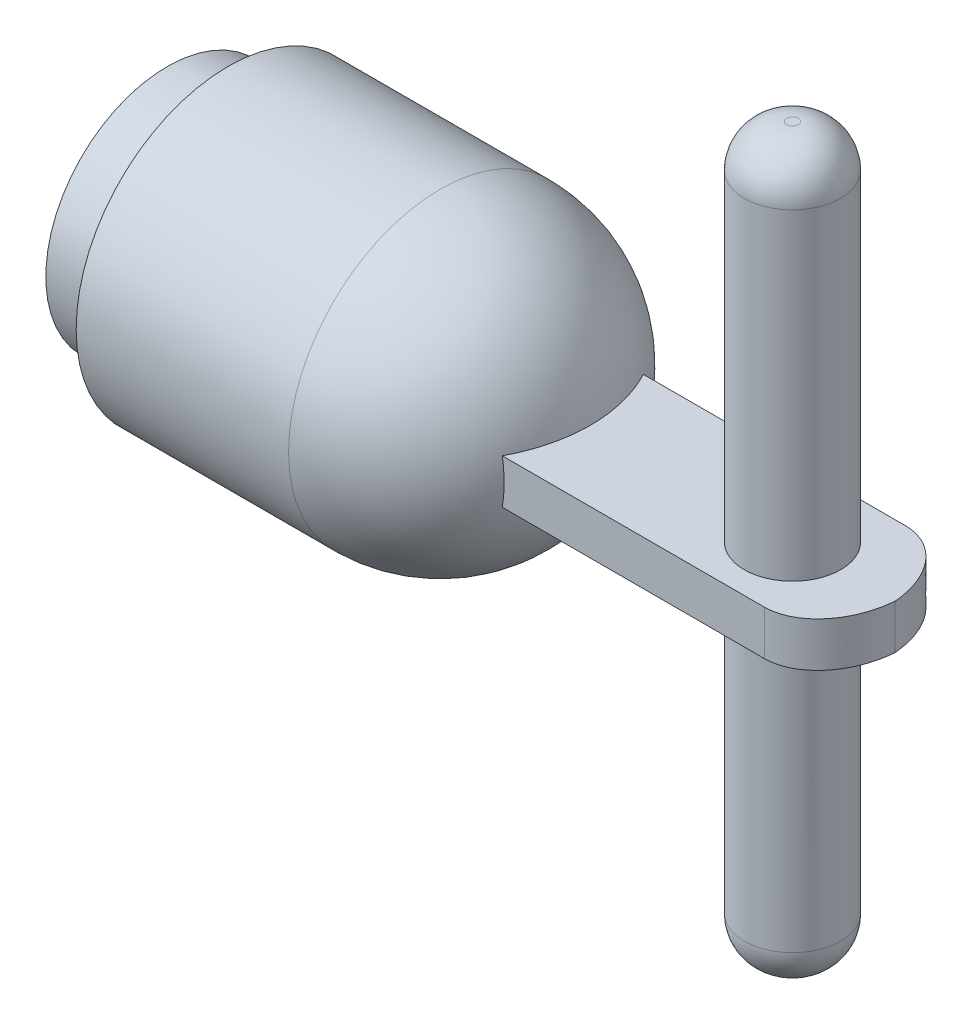
ISO-10303-21;
HEADER;
FILE_DESCRIPTION(('STEP AP214'),'2;1');
FILE_NAME('part.step','',(''),(''),'','','');
FILE_SCHEMA(('AUTOMOTIVE_DESIGN { 1 0 10303 214 1 1 1 1 }'));
ENDSEC;
DATA;
#1=APPLICATION_CONTEXT('core data for automotive mechanical design processes');
#2=APPLICATION_PROTOCOL_DEFINITION('international standard','automotive_design',2000,#1);
#3=PRODUCT_CONTEXT('',#1,'mechanical');
#4=PRODUCT('Part','Part','',(#3));
#5=PRODUCT_RELATED_PRODUCT_CATEGORY('part','',(#4));
#6=PRODUCT_DEFINITION_FORMATION('','',#4);
#7=PRODUCT_DEFINITION_CONTEXT('part definition',#1,'design');
#8=PRODUCT_DEFINITION('design','',#6,#7);
#9=PRODUCT_DEFINITION_SHAPE('','',#8);
#10=(LENGTH_UNIT() NAMED_UNIT(*) SI_UNIT(.MILLI.,.METRE.));
#11=(NAMED_UNIT(*) PLANE_ANGLE_UNIT() SI_UNIT($,.RADIAN.));
#12=(NAMED_UNIT(*) SI_UNIT($,.STERADIAN.) SOLID_ANGLE_UNIT());
#13=UNCERTAINTY_MEASURE_WITH_UNIT(LENGTH_MEASURE(1.E-05),#10,'distance_accuracy_value','');
#14=(GEOMETRIC_REPRESENTATION_CONTEXT(3) GLOBAL_UNCERTAINTY_ASSIGNED_CONTEXT((#13)) GLOBAL_UNIT_ASSIGNED_CONTEXT((#10,
#11,#12)) REPRESENTATION_CONTEXT('',''));
#15=CARTESIAN_POINT('',(0.,0.,0.));
#16=DIRECTION('',(0.,0.,1.));
#17=DIRECTION('',(1.,0.,0.));
#18=AXIS2_PLACEMENT_3D('',#15,#16,#17);
#19=CARTESIAN_POINT('',(10.,0.,0.));
#20=DIRECTION('',(-1.,0.,0.));
#21=DIRECTION('',(0.,0.,1.));
#22=AXIS2_PLACEMENT_3D('',#19,#20,#21);
#23=CYLINDRICAL_SURFACE('',#22,20.);
#24=CARTESIAN_POINT('',(10.,0.,0.));
#25=DIRECTION('',(1.,0.,0.));
#26=DIRECTION('',(0.,0.,-1.));
#27=AXIS2_PLACEMENT_3D('',#24,#25,#26);
#28=CIRCLE('',#27,20.);
#29=CARTESIAN_POINT('',(10.,0.,-20.));
#30=VERTEX_POINT('',#29);
#31=EDGE_CURVE('E117',#30,#30,#28,.T.);
#32=ORIENTED_EDGE('',*,*,#31,.F.);
#33=EDGE_LOOP('',(#32));
#34=FACE_BOUND('',#33,.T.);
#35=CARTESIAN_POINT('',(0.,0.,0.));
#36=DIRECTION('',(1.,0.,0.));
#37=DIRECTION('',(0.,0.,-1.));
#38=AXIS2_PLACEMENT_3D('',#35,#36,#37);
#39=CIRCLE('',#38,20.);
#40=CARTESIAN_POINT('',(0.,0.,-20.));
#41=VERTEX_POINT('',#40);
#42=EDGE_CURVE('E290',#41,#41,#39,.T.);
#43=ORIENTED_EDGE('',*,*,#42,.T.);
#44=EDGE_LOOP('',(#43));
#45=FACE_BOUND('',#44,.T.);
#46=ADVANCED_FACE('F38',(#34,#45),#23,.T.);
#47=CARTESIAN_POINT('',(0.,0.,0.));
#48=DIRECTION('',(1.,0.,0.));
#49=DIRECTION('',(0.,0.,-1.));
#50=AXIS2_PLACEMENT_3D('',#47,#48,#49);
#51=PLANE('',#50);
#52=ORIENTED_EDGE('',*,*,#42,.F.);
#53=EDGE_LOOP('',(#52));
#54=FACE_BOUND('',#53,.T.);
#55=ADVANCED_FACE('F321',(#54),#51,.F.);
#56=CARTESIAN_POINT('',(70.,0.,0.));
#57=DIRECTION('',(-1.,0.,0.));
#58=DIRECTION('',(0.,0.,1.));
#59=AXIS2_PLACEMENT_3D('',#56,#57,#58);
#60=CYLINDRICAL_SURFACE('',#59,25.);
#61=CARTESIAN_POINT('',(45.,0.,0.));
#62=DIRECTION('',(-1.,0.,0.));
#63=DIRECTION('',(0.,0.,1.));
#64=AXIS2_PLACEMENT_3D('',#61,#62,#63);
#65=CIRCLE('',#64,25.);
#66=CARTESIAN_POINT('',(45.,0.,25.));
#67=VERTEX_POINT('',#66);
#68=EDGE_CURVE('E113',#67,#67,#65,.T.);
#69=ORIENTED_EDGE('',*,*,#68,.T.);
#70=EDGE_LOOP('',(#69));
#71=FACE_BOUND('',#70,.T.);
#72=CARTESIAN_POINT('',(10.,0.,0.));
#73=DIRECTION('',(1.,0.,0.));
#74=DIRECTION('',(0.,0.,-1.));
#75=AXIS2_PLACEMENT_3D('',#72,#73,#74);
#76=CIRCLE('',#75,25.);
#77=CARTESIAN_POINT('',(10.,0.,-25.));
#78=VERTEX_POINT('',#77);
#79=EDGE_CURVE('E152',#78,#78,#76,.T.);
#80=ORIENTED_EDGE('',*,*,#79,.T.);
#81=EDGE_LOOP('',(#80));
#82=FACE_BOUND('',#81,.T.);
#83=ADVANCED_FACE('F327',(#71,#82),#60,.T.);
#84=CARTESIAN_POINT('',(10.,0.,0.));
#85=DIRECTION('',(1.,0.,0.));
#86=DIRECTION('',(0.,0.,-1.));
#87=AXIS2_PLACEMENT_3D('',#84,#85,#86);
#88=PLANE('',#87);
#89=ORIENTED_EDGE('',*,*,#31,.T.);
#90=EDGE_LOOP('',(#89));
#91=FACE_BOUND('',#90,.T.);
#92=ORIENTED_EDGE('',*,*,#79,.F.);
#93=EDGE_LOOP('',(#92));
#94=FACE_BOUND('',#93,.T.);
#95=ADVANCED_FACE('F335',(#91,#94),#88,.F.);
#96=CARTESIAN_POINT('',(45.,0.,0.));
#97=DIRECTION('',(1.,0.,0.));
#98=DIRECTION('',(0.,0.,-1.));
#99=AXIS2_PLACEMENT_3D('',#96,#97,#98);
#100=SPHERICAL_SURFACE('',#99,25.);
#101=CARTESIAN_POINT('',(45.,0.,11.6203604467989));
#102=DIRECTION('',(0.,0.,1.));
#103=DIRECTION('',(1.,0.,0.));
#104=AXIS2_PLACEMENT_3D('',#101,#102,#103);
#105=CIRCLE('',#104,22.1352032537872);
#106=CARTESIAN_POINT('',(66.8285758972523,3.67157968514468,11.6203604467989));
#107=VERTEX_POINT('',#106);
#108=CARTESIAN_POINT('',(66.8285758972523,-3.67157968514468,11.6203604467989));
#109=VERTEX_POINT('',#108);
#110=EDGE_CURVE('E93',#107,#109,#105,.F.);
#111=ORIENTED_EDGE('',*,*,#110,.F.);
#112=CARTESIAN_POINT('',(45.,3.67157968514468,0.));
#113=DIRECTION('',(0.,1.,0.));
#114=DIRECTION('',(0.,0.,1.));
#115=AXIS2_PLACEMENT_3D('',#112,#113,#114);
#116=CIRCLE('',#115,24.7289203689856);
#117=CARTESIAN_POINT('',(66.8285758972523,3.67157968514468,-11.6203604467989));
#118=VERTEX_POINT('',#117);
#119=EDGE_CURVE('E104',#118,#107,#116,.F.);
#120=ORIENTED_EDGE('',*,*,#119,.F.);
#121=CARTESIAN_POINT('',(45.,0.,-11.6203604467989));
#122=DIRECTION('',(0.,0.,-1.));
#123=DIRECTION('',(-1.,0.,0.));
#124=AXIS2_PLACEMENT_3D('',#121,#122,#123);
#125=CIRCLE('',#124,22.1352032537872);
#126=CARTESIAN_POINT('',(66.8285758972523,-3.67157968514468,-11.6203604467989));
#127=VERTEX_POINT('',#126);
#128=EDGE_CURVE('E112',#127,#118,#125,.F.);
#129=ORIENTED_EDGE('',*,*,#128,.F.);
#130=CARTESIAN_POINT('',(45.,-3.67157968514468,0.));
#131=DIRECTION('',(0.,-1.,0.));
#132=DIRECTION('',(0.,0.,-1.));
#133=AXIS2_PLACEMENT_3D('',#130,#131,#132);
#134=CIRCLE('',#133,24.7289203689856);
#135=EDGE_CURVE('E107',#109,#127,#134,.F.);
#136=ORIENTED_EDGE('',*,*,#135,.F.);
#137=EDGE_LOOP('',(#111,#120,#129,#136));
#138=FACE_BOUND('',#137,.T.);
#139=ORIENTED_EDGE('',*,*,#68,.F.);
#140=EDGE_LOOP('',(#139));
#141=FACE_BOUND('',#140,.T.);
#142=ADVANCED_FACE('F101',(#138,#141),#100,.T.);
#143=CARTESIAN_POINT('',(120.,3.67157968514468,11.6203604467989));
#144=DIRECTION('',(0.,0.,1.));
#145=DIRECTION('',(1.,0.,0.));
#146=AXIS2_PLACEMENT_3D('',#143,#144,#145);
#147=PLANE('',#146);
#148=DIRECTION('',(-1.,0.,0.));
#149=VECTOR('',#148,1.);
#150=CARTESIAN_POINT('',(120.,-3.67157968514468,11.6203604467989));
#151=LINE('',#150,#149);
#152=CARTESIAN_POINT('',(110.,-3.67157968514468,11.6203604467989));
#153=VERTEX_POINT('',#152);
#154=EDGE_CURVE('E141',#153,#109,#151,.T.);
#155=ORIENTED_EDGE('',*,*,#154,.F.);
#156=CARTESIAN_POINT('',(110.,4.03873765365915,11.6203604467989));
#157=CARTESIAN_POINT('',(110.,1.34624588455305,11.6203604467989));
#158=CARTESIAN_POINT('',(110.,-1.34624588455305,11.6203604467989));
#159=CARTESIAN_POINT('',(110.,-4.03873765365915,11.6203604467989));
#160=(BOUNDED_CURVE() B_SPLINE_CURVE(3,(#156,#157,#158,#159),.UNSPECIFIED.,.F.,
.F.) B_SPLINE_CURVE_WITH_KNOTS((4,4),(-0.000367157968514468,0.00771031733880384),
.UNSPECIFIED.) CURVE() GEOMETRIC_REPRESENTATION_ITEM() RATIONAL_B_SPLINE_CURVE((1.,1.,1.,1.)) REPRESENTATION_ITEM(''));
#161=CARTESIAN_POINT('',(110.,3.67157968514468,11.6203604467989));
#162=VERTEX_POINT('',#161);
#163=EDGE_CURVE('E12',#153,#162,#160,.F.);
#164=ORIENTED_EDGE('',*,*,#163,.T.);
#165=DIRECTION('',(-1.,0.,0.));
#166=VECTOR('',#165,1.);
#167=CARTESIAN_POINT('',(120.,3.67157968514468,11.6203604467989));
#168=LINE('',#167,#166);
#169=EDGE_CURVE('E90',#162,#107,#168,.T.);
#170=ORIENTED_EDGE('',*,*,#169,.T.);
#171=ORIENTED_EDGE('',*,*,#110,.T.);
#172=EDGE_LOOP('',(#155,#164,#170,#171));
#173=FACE_BOUND('',#172,.T.);
#174=ADVANCED_FACE('F92',(#173),#147,.T.);
#175=CARTESIAN_POINT('',(120.,-3.67157968514468,-11.6203604467989));
#176=DIRECTION('',(0.,-1.,0.));
#177=DIRECTION('',(0.,0.,-1.));
#178=AXIS2_PLACEMENT_3D('',#175,#176,#177);
#179=PLANE('',#178);
#180=CARTESIAN_POINT('',(103.030776268673,-3.67157968514469,0.));
#181=DIRECTION('',(0.,-1.,0.));
#182=DIRECTION('',(0.,0.,-1.));
#183=AXIS2_PLACEMENT_3D('',#180,#181,#182);
#184=CIRCLE('',#183,7.94343777137408);
#185=CARTESIAN_POINT('',(103.030776268673,-3.67157968514469,-7.94343777137408));
#186=VERTEX_POINT('',#185);
#187=EDGE_CURVE('E96',#186,#186,#184,.F.);
#188=ORIENTED_EDGE('',*,*,#187,.T.);
#189=EDGE_LOOP('',(#188));
#190=FACE_BOUND('',#189,.T.);
#191=DIRECTION('',(-1.,0.,0.));
#192=VECTOR('',#191,1.);
#193=CARTESIAN_POINT('',(120.,-3.67157968514468,-11.6203604467989));
#194=LINE('',#193,#192);
#195=CARTESIAN_POINT('',(110.,-3.67157968514468,-11.6203604467989));
#196=VERTEX_POINT('',#195);
#197=EDGE_CURVE('E138',#196,#127,#194,.T.);
#198=ORIENTED_EDGE('',*,*,#197,.F.);
#199=CARTESIAN_POINT('',(120.,-3.67157968514468,1.37963955320111));
#200=CARTESIAN_POINT('',(120.,-3.67157968514468,-11.6203604467989));
#201=CARTESIAN_POINT('',(110.,-3.67157968514468,-11.6203604467989));
#202=(BOUNDED_CURVE() B_SPLINE_CURVE(2,(#199,#200,#201),.UNSPECIFIED.,.F.,
.F.) B_SPLINE_CURVE_WITH_KNOTS((3,3),(0.,1.),
.UNSPECIFIED.) CURVE() GEOMETRIC_REPRESENTATION_ITEM() RATIONAL_B_SPLINE_CURVE((1.,
0.707106781186548,1.)) REPRESENTATION_ITEM(''));
#203=CARTESIAN_POINT('',(119.943943015045,-3.67157968514468,3.35706600802981E-05));
#204=VERTEX_POINT('',#203);
#205=EDGE_CURVE('E201',#196,#204,#202,.F.);
#206=ORIENTED_EDGE('',*,*,#205,.T.);
#207=CARTESIAN_POINT('',(110.,-3.67157968514468,11.6203604467989));
#208=CARTESIAN_POINT('',(120.,-3.67157968514468,11.6203604467989));
#209=CARTESIAN_POINT('',(120.,-3.67157968514468,-1.37963955320111));
#210=(BOUNDED_CURVE() B_SPLINE_CURVE(2,(#207,#208,#209),.UNSPECIFIED.,.F.,
.F.) B_SPLINE_CURVE_WITH_KNOTS((3,3),(0.,1.),
.UNSPECIFIED.) CURVE() GEOMETRIC_REPRESENTATION_ITEM() RATIONAL_B_SPLINE_CURVE((1.,
0.707106781186548,1.)) REPRESENTATION_ITEM(''));
#211=EDGE_CURVE('E281',#204,#153,#210,.F.);
#212=ORIENTED_EDGE('',*,*,#211,.T.);
#213=ORIENTED_EDGE('',*,*,#154,.T.);
#214=ORIENTED_EDGE('',*,*,#135,.T.);
#215=EDGE_LOOP('',(#198,#206,#212,#213,#214));
#216=FACE_BOUND('',#215,.T.);
#217=ADVANCED_FACE('F287',(#190,#216),#179,.T.);
#218=CARTESIAN_POINT('',(120.,3.67157968514468,-11.6203604467989));
#219=DIRECTION('',(0.,0.,-1.));
#220=DIRECTION('',(-1.,0.,0.));
#221=AXIS2_PLACEMENT_3D('',#218,#219,#220);
#222=PLANE('',#221);
#223=DIRECTION('',(-1.,0.,0.));
#224=VECTOR('',#223,1.);
#225=CARTESIAN_POINT('',(120.,3.67157968514468,-11.6203604467989));
#226=LINE('',#225,#224);
#227=CARTESIAN_POINT('',(110.,3.67157968514468,-11.6203604467989));
#228=VERTEX_POINT('',#227);
#229=EDGE_CURVE('E95',#228,#118,#226,.T.);
#230=ORIENTED_EDGE('',*,*,#229,.F.);
#231=CARTESIAN_POINT('',(110.,-4.03873765365915,-11.6203604467989));
#232=CARTESIAN_POINT('',(110.,-1.34624588455305,-11.6203604467989));
#233=CARTESIAN_POINT('',(110.,1.34624588455305,-11.6203604467989));
#234=CARTESIAN_POINT('',(110.,4.03873765365915,-11.6203604467989));
#235=(BOUNDED_CURVE() B_SPLINE_CURVE(3,(#231,#232,#233,#234),.UNSPECIFIED.,.F.,
.F.) B_SPLINE_CURVE_WITH_KNOTS((4,4),(-0.00771031733880384,0.000367157968514468),
.UNSPECIFIED.) CURVE() GEOMETRIC_REPRESENTATION_ITEM() RATIONAL_B_SPLINE_CURVE((1.,1.,1.,1.)) REPRESENTATION_ITEM(''));
#236=EDGE_CURVE('E137',#228,#196,#235,.F.);
#237=ORIENTED_EDGE('',*,*,#236,.T.);
#238=ORIENTED_EDGE('',*,*,#197,.T.);
#239=ORIENTED_EDGE('',*,*,#128,.T.);
#240=EDGE_LOOP('',(#230,#237,#238,#239));
#241=FACE_BOUND('',#240,.T.);
#242=ADVANCED_FACE('F175',(#241),#222,.T.);
#243=CARTESIAN_POINT('',(120.,3.67157968514468,-11.6203604467989));
#244=DIRECTION('',(0.,1.,0.));
#245=DIRECTION('',(0.,0.,1.));
#246=AXIS2_PLACEMENT_3D('',#243,#244,#245);
#247=PLANE('',#246);
#248=CARTESIAN_POINT('',(103.030776268673,3.67157968514469,0.));
#249=DIRECTION('',(0.,1.,0.));
#250=DIRECTION('',(0.,0.,1.));
#251=AXIS2_PLACEMENT_3D('',#248,#249,#250);
#252=CIRCLE('',#251,7.94343777137408);
#253=CARTESIAN_POINT('',(103.030776268673,3.67157968514469,7.94343777137408));
#254=VERTEX_POINT('',#253);
#255=EDGE_CURVE('E122',#254,#254,#252,.F.);
#256=ORIENTED_EDGE('',*,*,#255,.T.);
#257=EDGE_LOOP('',(#256));
#258=FACE_BOUND('',#257,.T.);
#259=CARTESIAN_POINT('',(120.,3.67157968514468,-1.37963955320111));
#260=CARTESIAN_POINT('',(120.,3.67157968514468,11.6203604467989));
#261=CARTESIAN_POINT('',(110.,3.67157968514468,11.6203604467989));
#262=(BOUNDED_CURVE() B_SPLINE_CURVE(2,(#259,#260,#261),.UNSPECIFIED.,.F.,
.F.) B_SPLINE_CURVE_WITH_KNOTS((3,3),(0.,1.),
.UNSPECIFIED.) CURVE() GEOMETRIC_REPRESENTATION_ITEM() RATIONAL_B_SPLINE_CURVE((1.,
0.707106781186548,1.)) REPRESENTATION_ITEM(''));
#263=CARTESIAN_POINT('',(119.943961006475,3.67157968514468,3.49293142133572E-05));
#264=VERTEX_POINT('',#263);
#265=EDGE_CURVE('E59',#162,#264,#262,.F.);
#266=ORIENTED_EDGE('',*,*,#265,.T.);
#267=CARTESIAN_POINT('',(110.,3.67157968514468,-11.6203604467989));
#268=CARTESIAN_POINT('',(120.,3.67157968514468,-11.6203604467989));
#269=CARTESIAN_POINT('',(120.,3.67157968514468,1.37963955320111));
#270=(BOUNDED_CURVE() B_SPLINE_CURVE(2,(#267,#268,#269),.UNSPECIFIED.,.F.,
.F.) B_SPLINE_CURVE_WITH_KNOTS((3,3),(0.,1.),
.UNSPECIFIED.) CURVE() GEOMETRIC_REPRESENTATION_ITEM() RATIONAL_B_SPLINE_CURVE((1.,
0.707106781186548,1.)) REPRESENTATION_ITEM(''));
#271=EDGE_CURVE('E52',#264,#228,#270,.F.);
#272=ORIENTED_EDGE('',*,*,#271,.T.);
#273=ORIENTED_EDGE('',*,*,#229,.T.);
#274=ORIENTED_EDGE('',*,*,#119,.T.);
#275=ORIENTED_EDGE('',*,*,#169,.F.);
#276=EDGE_LOOP('',(#266,#272,#273,#274,#275));
#277=FACE_BOUND('',#276,.T.);
#278=ADVANCED_FACE('F110',(#258,#277),#247,.T.);
#279=CARTESIAN_POINT('',(103.030776268673,63.6715796851447,0.));
#280=DIRECTION('',(0.,1.,0.));
#281=DIRECTION('',(0.,0.,1.));
#282=AXIS2_PLACEMENT_3D('',#279,#280,#281);
#283=PLANE('',#282);
#284=CARTESIAN_POINT('',(103.030776268673,63.6715796851447,0.));
#285=DIRECTION('',(0.,1.,0.));
#286=DIRECTION('',(0.,0.,1.));
#287=AXIS2_PLACEMENT_3D('',#284,#285,#286);
#288=CIRCLE('',#287,0.94343777137408);
#289=CARTESIAN_POINT('',(103.030776268673,63.6715796851447,0.94343777137408));
#290=VERTEX_POINT('',#289);
#291=EDGE_CURVE('E108',#290,#290,#288,.T.);
#292=ORIENTED_EDGE('',*,*,#291,.T.);
#293=EDGE_LOOP('',(#292));
#294=FACE_BOUND('',#293,.T.);
#295=ADVANCED_FACE('F174',(#294),#283,.T.);
#296=CARTESIAN_POINT('',(103.030776268673,63.6715796851447,0.));
#297=DIRECTION('',(0.,-1.,0.));
#298=DIRECTION('',(0.,0.,-1.));
#299=AXIS2_PLACEMENT_3D('',#296,#297,#298);
#300=CYLINDRICAL_SURFACE('',#299,7.94343777137408);
#301=CARTESIAN_POINT('',(103.030776268673,56.6715796851447,0.));
#302=DIRECTION('',(0.,1.,0.));
#303=DIRECTION('',(0.,0.,1.));
#304=AXIS2_PLACEMENT_3D('',#301,#302,#303);
#305=CIRCLE('',#304,7.94343777137408);
#306=CARTESIAN_POINT('',(103.030776268673,56.6715796851447,7.94343777137408));
#307=VERTEX_POINT('',#306);
#308=EDGE_CURVE('E128',#307,#307,#305,.F.);
#309=ORIENTED_EDGE('',*,*,#308,.T.);
#310=EDGE_LOOP('',(#309));
#311=FACE_BOUND('',#310,.T.);
#312=ORIENTED_EDGE('',*,*,#255,.F.);
#313=EDGE_LOOP('',(#312));
#314=FACE_BOUND('',#313,.T.);
#315=ADVANCED_FACE('F305',(#311,#314),#300,.T.);
#316=CARTESIAN_POINT('',(103.030776268673,-49.3284203148553,0.));
#317=DIRECTION('',(0.,1.,0.));
#318=DIRECTION('',(0.,0.,1.));
#319=AXIS2_PLACEMENT_3D('',#316,#317,#318);
#320=CIRCLE('',#319,7.94343777137408);
#321=CARTESIAN_POINT('',(103.030776268673,-49.3284203148553,7.94343777137408));
#322=VERTEX_POINT('',#321);
#323=EDGE_CURVE('E131',#322,#322,#320,.T.);
#324=ORIENTED_EDGE('',*,*,#323,.T.);
#325=EDGE_LOOP('',(#324));
#326=FACE_BOUND('',#325,.T.);
#327=ORIENTED_EDGE('',*,*,#187,.F.);
#328=EDGE_LOOP('',(#327));
#329=FACE_BOUND('',#328,.T.);
#330=ADVANCED_FACE('F309',(#326,#329),#300,.T.);
#331=CARTESIAN_POINT('',(103.030776268673,-56.3284203148553,0.));
#332=DIRECTION('',(0.,1.,0.));
#333=DIRECTION('',(0.,0.,1.));
#334=AXIS2_PLACEMENT_3D('',#331,#332,#333);
#335=PLANE('',#334);
#336=CARTESIAN_POINT('',(103.030776268673,-56.3284203148553,0.));
#337=DIRECTION('',(0.,1.,0.));
#338=DIRECTION('',(0.,0.,1.));
#339=AXIS2_PLACEMENT_3D('',#336,#337,#338);
#340=CIRCLE('',#339,0.94343777137408);
#341=CARTESIAN_POINT('',(103.030776268673,-56.3284203148553,0.94343777137408));
#342=VERTEX_POINT('',#341);
#343=EDGE_CURVE('E134',#342,#342,#340,.F.);
#344=ORIENTED_EDGE('',*,*,#343,.T.);
#345=EDGE_LOOP('',(#344));
#346=FACE_BOUND('',#345,.T.);
#347=ADVANCED_FACE('F311',(#346),#335,.F.);
#348=CARTESIAN_POINT('',(103.030776268673,56.6715796851447,0.));
#349=DIRECTION('',(0.,1.,0.));
#350=DIRECTION('',(0.,0.,1.));
#351=AXIS2_PLACEMENT_3D('',#348,#349,#350);
#352=DEGENERATE_TOROIDAL_SURFACE('',#351,0.94343777137408,7.,.T.);
#353=ORIENTED_EDGE('',*,*,#308,.F.);
#354=EDGE_LOOP('',(#353));
#355=FACE_BOUND('',#354,.T.);
#356=ORIENTED_EDGE('',*,*,#291,.F.);
#357=EDGE_LOOP('',(#356));
#358=FACE_BOUND('',#357,.T.);
#359=ADVANCED_FACE('F314',(#355,#358),#352,.T.);
#360=CARTESIAN_POINT('',(103.030776268673,-49.3284203148553,0.));
#361=DIRECTION('',(0.,1.,0.));
#362=DIRECTION('',(0.,0.,1.));
#363=AXIS2_PLACEMENT_3D('',#360,#361,#362);
#364=DEGENERATE_TOROIDAL_SURFACE('',#363,0.94343777137408,7.,.T.);
#365=ORIENTED_EDGE('',*,*,#343,.F.);
#366=EDGE_LOOP('',(#365));
#367=FACE_BOUND('',#366,.T.);
#368=ORIENTED_EDGE('',*,*,#323,.F.);
#369=EDGE_LOOP('',(#368));
#370=FACE_BOUND('',#369,.T.);
#371=ADVANCED_FACE('F221',(#367,#370),#364,.T.);
#372=CARTESIAN_POINT('',(120.,4.03873765365915,-1.37963955320111));
#373=CARTESIAN_POINT('',(120.,1.34624588455305,-1.37963955320111));
#374=CARTESIAN_POINT('',(120.,-1.34624588455305,-1.37963955320111));
#375=CARTESIAN_POINT('',(120.,-4.03873765365915,-1.37963955320111));
#376=CARTESIAN_POINT('',(120.,4.03873765365915,11.6203604467989));
#377=CARTESIAN_POINT('',(120.,1.34624588455305,11.6203604467989));
#378=CARTESIAN_POINT('',(120.,-1.34624588455305,11.6203604467989));
#379=CARTESIAN_POINT('',(120.,-4.03873765365915,11.6203604467989));
#380=CARTESIAN_POINT('',(110.,4.03873765365915,11.6203604467989));
#381=CARTESIAN_POINT('',(110.,1.34624588455305,11.6203604467989));
#382=CARTESIAN_POINT('',(110.,-1.34624588455305,11.6203604467989));
#383=CARTESIAN_POINT('',(110.,-4.03873765365915,11.6203604467989));
#384=(BOUNDED_SURFACE() B_SPLINE_SURFACE(2,3,((#372,#373,#374,#375),(#376,#377,#378,#379),(#380,
#381,#382,#383)),.UNSPECIFIED.,.F.,.F.,.F.) B_SPLINE_SURFACE_WITH_KNOTS((3,3),(4,4),(0.,1.),
(-0.000367157968514468,0.00771031733880384),
.UNSPECIFIED.) GEOMETRIC_REPRESENTATION_ITEM() RATIONAL_B_SPLINE_SURFACE(((1.,1.,1.,1.),
(0.707106781186548,0.707106781186548,0.707106781186548,0.707106781186548),(1.,1.,1.,1.))) REPRESENTATION_ITEM('') SURFACE());
#385=CARTESIAN_POINT('',(119.943526772553,4.03873765365915,0.));
#386=CARTESIAN_POINT('',(119.943526772553,1.34624588455305,0.));
#387=CARTESIAN_POINT('',(119.943526772553,-1.34624588455305,0.));
#388=CARTESIAN_POINT('',(119.943526772553,-4.03873765365915,0.));
#389=(BOUNDED_CURVE() B_SPLINE_CURVE(3,(#385,#386,#387,#388),.UNSPECIFIED.,.F.,
.F.) B_SPLINE_CURVE_WITH_KNOTS((4,4),(-0.00771031733880384,0.000367157968514468),
.UNSPECIFIED.) CURVE() GEOMETRIC_REPRESENTATION_ITEM() RATIONAL_B_SPLINE_CURVE((0.960043304554344,
0.960043304554344,0.960043304554344,0.960043304554344)) REPRESENTATION_ITEM(''));
#390=EDGE_CURVE('E125',#264,#204,#389,.T.);
#391=ORIENTED_EDGE('',*,*,#390,.F.);
#392=ORIENTED_EDGE('',*,*,#265,.F.);
#393=ORIENTED_EDGE('',*,*,#163,.F.);
#394=ORIENTED_EDGE('',*,*,#211,.F.);
#395=EDGE_LOOP('',(#391,#392,#393,#394));
#396=FACE_BOUND('',#395,.T.);
#397=ADVANCED_FACE('F41',(#396),#384,.T.);
#398=CARTESIAN_POINT('',(120.,-4.03873765365915,1.37963955320111));
#399=CARTESIAN_POINT('',(120.,-1.34624588455305,1.37963955320111));
#400=CARTESIAN_POINT('',(120.,1.34624588455305,1.37963955320111));
#401=CARTESIAN_POINT('',(120.,4.03873765365915,1.37963955320111));
#402=CARTESIAN_POINT('',(120.,-4.03873765365915,-11.6203604467989));
#403=CARTESIAN_POINT('',(120.,-1.34624588455305,-11.6203604467989));
#404=CARTESIAN_POINT('',(120.,1.34624588455305,-11.6203604467989));
#405=CARTESIAN_POINT('',(120.,4.03873765365915,-11.6203604467989));
#406=CARTESIAN_POINT('',(110.,-4.03873765365915,-11.6203604467989));
#407=CARTESIAN_POINT('',(110.,-1.34624588455305,-11.6203604467989));
#408=CARTESIAN_POINT('',(110.,1.34624588455305,-11.6203604467989));
#409=CARTESIAN_POINT('',(110.,4.03873765365915,-11.6203604467989));
#410=(BOUNDED_SURFACE() B_SPLINE_SURFACE(2,3,((#398,#399,#400,#401),(#402,#403,#404,#405),(#406,
#407,#408,#409)),.UNSPECIFIED.,.F.,.F.,.F.) B_SPLINE_SURFACE_WITH_KNOTS((3,3),(4,4),(0.,1.),
(-0.00771031733880384,0.000367157968514468),
.UNSPECIFIED.) GEOMETRIC_REPRESENTATION_ITEM() RATIONAL_B_SPLINE_SURFACE(((1.,1.,1.,1.),
(0.707106781186548,0.707106781186548,0.707106781186548,0.707106781186548),(1.,1.,1.,1.))) REPRESENTATION_ITEM('') SURFACE());
#411=ORIENTED_EDGE('',*,*,#271,.F.);
#412=ORIENTED_EDGE('',*,*,#390,.T.);
#413=ORIENTED_EDGE('',*,*,#205,.F.);
#414=ORIENTED_EDGE('',*,*,#236,.F.);
#415=EDGE_LOOP('',(#411,#412,#413,#414));
#416=FACE_BOUND('',#415,.T.);
#417=ADVANCED_FACE('F208',(#416),#410,.T.);
#418=CLOSED_SHELL('',(#46,#55,#83,#95,#142,#174,#217,#242,#278,#295,#315,#330,#347,#359,#371,
#397,#417));
#419=MANIFOLD_SOLID_BREP('B2',#418);
#420=ADVANCED_BREP_SHAPE_REPRESENTATION('',(#18,#419),#14);
#421=SHAPE_DEFINITION_REPRESENTATION(#9,#420);
ENDSEC;
END-ISO-10303-21;
